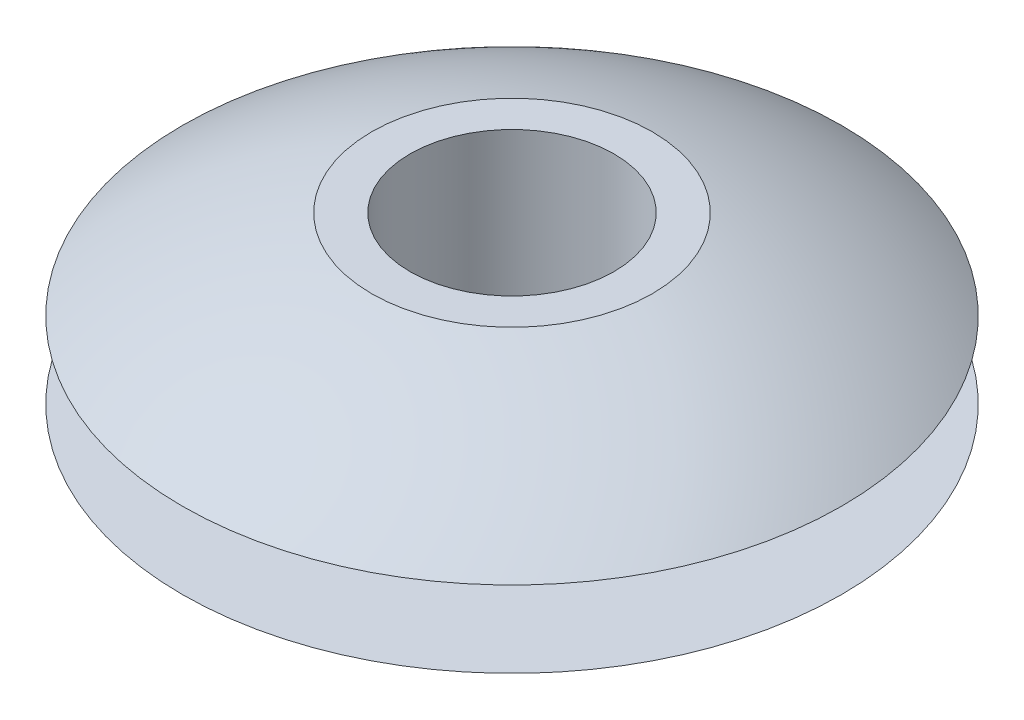
ISO-10303-21;
HEADER;
FILE_DESCRIPTION(('STEP AP214'),'2;1');
FILE_NAME('part.step','',(''),(''),'','','');
FILE_SCHEMA(('AUTOMOTIVE_DESIGN { 1 0 10303 214 1 1 1 1 }'));
ENDSEC;
DATA;
#1=APPLICATION_CONTEXT('core data for automotive mechanical design processes');
#2=APPLICATION_PROTOCOL_DEFINITION('international standard','automotive_design',2000,#1);
#3=PRODUCT_CONTEXT('',#1,'mechanical');
#4=PRODUCT('Part','Part','',(#3));
#5=PRODUCT_RELATED_PRODUCT_CATEGORY('part','',(#4));
#6=PRODUCT_DEFINITION_FORMATION('','',#4);
#7=PRODUCT_DEFINITION_CONTEXT('part definition',#1,'design');
#8=PRODUCT_DEFINITION('design','',#6,#7);
#9=PRODUCT_DEFINITION_SHAPE('','',#8);
#10=(LENGTH_UNIT() NAMED_UNIT(*) SI_UNIT(.MILLI.,.METRE.));
#11=(NAMED_UNIT(*) PLANE_ANGLE_UNIT() SI_UNIT($,.RADIAN.));
#12=(NAMED_UNIT(*) SI_UNIT($,.STERADIAN.) SOLID_ANGLE_UNIT());
#13=UNCERTAINTY_MEASURE_WITH_UNIT(LENGTH_MEASURE(1.E-05),#10,'distance_accuracy_value','');
#14=(GEOMETRIC_REPRESENTATION_CONTEXT(3) GLOBAL_UNCERTAINTY_ASSIGNED_CONTEXT((#13)) GLOBAL_UNIT_ASSIGNED_CONTEXT((#10,
#11,#12)) REPRESENTATION_CONTEXT('',''));
#15=CARTESIAN_POINT('',(0.,0.,0.));
#16=DIRECTION('',(0.,0.,1.));
#17=DIRECTION('',(1.,0.,0.));
#18=AXIS2_PLACEMENT_3D('',#15,#16,#17);
#19=CARTESIAN_POINT('',(0.,-8.1507042020704,0.));
#20=DIRECTION('',(0.,1.,0.));
#21=DIRECTION('',(0.,0.,-1.));
#22=AXIS2_PLACEMENT_3D('',#19,#20,#21);
#23=SPHERICAL_SURFACE('',#22,11.);
#24=CARTESIAN_POINT('',(0.,2.5,0.));
#25=DIRECTION('',(0.,1.,0.));
#26=DIRECTION('',(0.,0.,1.));
#27=AXIS2_PLACEMENT_3D('',#24,#25,#26);
#28=CIRCLE('',#27,2.75);
#29=CARTESIAN_POINT('',(0.,2.5,-2.75000000000002));
#30=VERTEX_POINT('',#29);
#31=EDGE_CURVE('E59',#30,#30,#28,.T.);
#32=CARTESIAN_POINT('',(0.,0.750000000000001,0.));
#33=DIRECTION('',(0.,1.,0.));
#34=DIRECTION('',(0.,0.,1.));
#35=AXIS2_PLACEMENT_3D('',#32,#33,#34);
#36=CIRCLE('',#35,6.46354892510658);
#37=CARTESIAN_POINT('',(0.,0.749999999999999,-6.46354892510658));
#38=VERTEX_POINT('',#37);
#39=EDGE_CURVE('E10',#38,#38,#36,.T.);
#40=CARTESIAN_POINT('',(0.,2.5,-2.75000000000002));
#41=CARTESIAN_POINT('',(0.,2.489246263885,-2.79164909075996));
#42=CARTESIAN_POINT('',(0.,2.47824820386657,-2.83323509709761));
#43=CARTESIAN_POINT('',(0.,2.4557650024796,-2.91627523204028));
#44=CARTESIAN_POINT('',(0.,2.44427986111107,-2.95772936064529));
#45=CARTESIAN_POINT('',(0.,2.4208240634807,-3.04050003123465));
#46=CARTESIAN_POINT('',(0.,2.40885340721886,-3.08181657321899));
#47=CARTESIAN_POINT('',(0.,2.38442823103843,-3.1643063854772));
#48=CARTESIAN_POINT('',(0.,2.37197371111983,-3.20547965575107));
#49=CARTESIAN_POINT('',(0.,2.34658252064056,-3.28767725791299));
#50=CARTESIAN_POINT('',(0.,2.33364585007988,-3.32870158980105));
#51=CARTESIAN_POINT('',(0.,2.30729213897582,-3.41059566936254));
#52=CARTESIAN_POINT('',(0.,2.29387509843244,-3.45146541703598));
#53=CARTESIAN_POINT('',(0.,2.2665624937869,-3.53304470352028));
#54=CARTESIAN_POINT('',(0.,2.25266692968475,-3.57375424233113));
#55=CARTESIAN_POINT('',(0.,2.22439919029418,-3.65500750851582));
#56=CARTESIAN_POINT('',(0.,2.21002701500575,-3.69555123588965));
#57=CARTESIAN_POINT('',(0.,2.18080803118311,-3.77646729943865));
#58=CARTESIAN_POINT('',(0.,2.16596122264889,-3.81683963561382));
#59=CARTESIAN_POINT('',(0.,2.13579501560235,-3.89740736059306));
#60=CARTESIAN_POINT('',(0.,2.12047561709004,-3.93760274939714));
#61=CARTESIAN_POINT('',(0.,2.08936633839261,-4.01781104781338));
#62=CARTESIAN_POINT('',(0.,2.0735764582075,-4.05782395742554));
#63=CARTESIAN_POINT('',(0.,2.04152838921947,-4.13766179075061));
#64=CARTESIAN_POINT('',(0.,2.02527020041656,-4.17748671446352));
#65=CARTESIAN_POINT('',(0.,1.99228775169797,-4.25694309515399));
#66=CARTESIAN_POINT('',(0.,1.97556349178229,-4.29657455213154));
#67=CARTESIAN_POINT('',(0.,1.94165120248547,-4.3756385451407));
#68=CARTESIAN_POINT('',(0.,1.92446317310432,-4.4150710811723));
#69=CARTESIAN_POINT('',(0.,1.88962571034932,-4.49373180545511));
#70=CARTESIAN_POINT('',(0.,1.87197627697547,-4.53295999370632));
#71=CARTESIAN_POINT('',(0.,1.83621843520772,-4.61120662371693));
#72=CARTESIAN_POINT('',(0.,1.81811002681384,-4.65022506547632));
#73=CARTESIAN_POINT('',(0.,1.78143672714437,-4.72804683265785));
#74=CARTESIAN_POINT('',(0.,1.76287183586878,-4.76685015807998));
#75=CARTESIAN_POINT('',(0.,1.7252881253969,-4.84423635234659));
#76=CARTESIAN_POINT('',(0.,1.7062693062006,-4.88281922119105));
#77=CARTESIAN_POINT('',(0.,1.66778035731933,-4.95975919240185));
#78=CARTESIAN_POINT('',(0.,1.64831022763435,-4.99811629476818));
#79=CARTESIAN_POINT('',(0.,1.60892133731859,-5.07459945419295));
#80=CARTESIAN_POINT('',(0.,1.58900257668779,-5.1127255112514));
#81=CARTESIAN_POINT('',(0.,1.5487191657653,-5.18874133302787));
#82=CARTESIAN_POINT('',(0.,1.5283545154736,-5.2266310977459));
#83=CARTESIAN_POINT('',(0.,1.48718212787902,-5.30216912032833));
#84=CARTESIAN_POINT('',(0.,1.46637439057614,-5.33981737819275));
#85=CARTESIAN_POINT('',(0.,1.42431869258791,-5.41486720579165));
#86=CARTESIAN_POINT('',(0.,1.40307073190255,-5.45226877552613));
#87=CARTESIAN_POINT('',(0.,1.36013751136346,-5.52682007953919));
#88=CARTESIAN_POINT('',(0.,1.33845225150972,-5.56396981381776));
#89=CARTESIAN_POINT('',(0.,1.29464741702896,-5.63801233425033));
#90=CARTESIAN_POINT('',(0.,1.27252784240196,-5.67490512040433));
#91=CARTESIAN_POINT('',(0.,1.22785742254723,-5.74842866728515));
#92=CARTESIAN_POINT('',(0.,1.20530657731952,-5.78505942801196));
#93=CARTESIAN_POINT('',(0.,1.15977671976784,-5.85805388278172));
#94=CARTESIAN_POINT('',(0.,1.13679770744387,-5.89441757682465));
#95=CARTESIAN_POINT('',(0.,1.09041467820817,-5.96687289378001));
#96=CARTESIAN_POINT('',(0.,1.06701066129643,-6.00296451669243));
#97=CARTESIAN_POINT('',(0.,1.01978084359208,-6.07487072417647));
#98=CARTESIAN_POINT('',(0.,0.995955042799467,-6.1106853087481));
#99=CARTESIAN_POINT('',(0.,0.9478849371777,-6.18203251123952));
#100=CARTESIAN_POINT('',(0.,0.923640632348549,-6.21756512915931));
#101=CARTESIAN_POINT('',(0.,0.874736852025339,-6.28834350595893));
#102=CARTESIAN_POINT('',(0.,0.850077376531281,-6.32358926483875));
#103=CARTESIAN_POINT('',(0.,0.800346660571288,-6.39378908140553));
#104=CARTESIAN_POINT('',(0.,0.775275420105355,-6.42874313909249));
#105=CARTESIAN_POINT('',(0.,0.749999999999999,-6.46354892510658));
#106=B_SPLINE_CURVE_WITH_KNOTS('',3,(#40,#41,#42,#43,#44,#45,#46,#47,#48,#49,#50,#51,#52,#53,
#54,#55,#56,#57,#58,#59,#60,#61,#62,#63,#64,#65,#66,#67,#68,#69,#70,#71,#72,#73,#74,#75,#76,#77,
#78,#79,#80,#81,#82,#83,#84,#85,#86,#87,#88,#89,#90,#91,#92,#93,#94,#95,#96,#97,#98,#99,#100,
#101,#102,#103,#104,#105),.UNSPECIFIED.,.F.,.F.,(4,2,2,2,2,2,2,2,2,2,2,2,2,2,2,2,2,2,2,2,2,2,2,
2,2,2,2,2,2,2,2,2,4),(0.,0.129044237844231,0.258088475688461,0.387132713532692,
0.516176951376923,0.645221189221153,0.774265427065384,0.903309664909614,1.03235390275384,
1.16139814059808,1.29044237844231,1.41948661628654,1.54853085413077,1.677575091975,
1.80661932981923,1.93566356766346,2.06470780550769,2.19375204335192,2.32279628119615,
2.45184051904038,2.58088475688461,2.70992899472884,2.83897323257307,2.9680174704173,
3.09706170826153,3.22610594610576,3.35515018394999,3.48419442179422,3.61323865963845,
3.74228289748268,3.87132713532691,4.00037137317115,4.12941561101538),.UNSPECIFIED.);
#107=EDGE_CURVE('BSEAM31',#30,#38,#106,.T.);
#108=ORIENTED_EDGE('',*,*,#31,.F.);
#109=ORIENTED_EDGE('',*,*,#39,.T.);
#110=ORIENTED_EDGE('',*,*,#107,.T.);
#111=ORIENTED_EDGE('',*,*,#107,.F.);
#112=EDGE_LOOP('',(#108,#110,#109,#111));
#113=FACE_BOUND('',#112,.T.);
#114=ADVANCED_FACE('F31',(#113),#23,.T.);
#115=CARTESIAN_POINT('',(0.,0.75,-6.46354892510658));
#116=DIRECTION('',(0.,1.,0.));
#117=DIRECTION('',(0.,0.,1.));
#118=AXIS2_PLACEMENT_3D('',#115,#116,#117);
#119=PLANE('',#118);
#120=ORIENTED_EDGE('',*,*,#39,.F.);
#121=EDGE_LOOP('',(#120));
#122=FACE_BOUND('',#121,.T.);
#123=CARTESIAN_POINT('',(0.,0.750000000000001,0.));
#124=DIRECTION('',(0.,1.,0.));
#125=DIRECTION('',(0.,0.,1.));
#126=AXIS2_PLACEMENT_3D('',#123,#124,#125);
#127=CIRCLE('',#126,2.75);
#128=CARTESIAN_POINT('',(0.,0.750000000000001,2.75));
#129=VERTEX_POINT('',#128);
#130=EDGE_CURVE('E37',#129,#129,#127,.T.);
#131=ORIENTED_EDGE('',*,*,#130,.T.);
#132=EDGE_LOOP('',(#131));
#133=FACE_BOUND('',#132,.T.);
#134=ADVANCED_FACE('F66',(#122,#133),#119,.F.);
#135=CARTESIAN_POINT('',(0.,32.3385527519094,0.));
#136=DIRECTION('',(0.,1.,0.));
#137=DIRECTION('',(0.,0.,1.));
#138=AXIS2_PLACEMENT_3D('',#135,#136,#137);
#139=CYLINDRICAL_SURFACE('',#138,2.75);
#140=ORIENTED_EDGE('',*,*,#130,.F.);
#141=EDGE_LOOP('',(#140));
#142=FACE_BOUND('',#141,.T.);
#143=CARTESIAN_POINT('',(0.,-0.750000000000001,0.));
#144=DIRECTION('',(0.,1.,0.));
#145=DIRECTION('',(0.,0.,1.));
#146=AXIS2_PLACEMENT_3D('',#143,#144,#145);
#147=CIRCLE('',#146,2.75);
#148=CARTESIAN_POINT('',(0.,-0.750000000000001,2.75));
#149=VERTEX_POINT('',#148);
#150=EDGE_CURVE('E41',#149,#149,#147,.T.);
#151=ORIENTED_EDGE('',*,*,#150,.T.);
#152=EDGE_LOOP('',(#151));
#153=FACE_BOUND('',#152,.T.);
#154=ADVANCED_FACE('F70',(#142,#153),#139,.T.);
#155=CARTESIAN_POINT('',(0.,-0.749999999999999,-6.46354892510658));
#156=DIRECTION('',(0.,-1.,0.));
#157=DIRECTION('',(0.,0.,-1.));
#158=AXIS2_PLACEMENT_3D('',#155,#156,#157);
#159=PLANE('',#158);
#160=ORIENTED_EDGE('',*,*,#150,.F.);
#161=EDGE_LOOP('',(#160));
#162=FACE_BOUND('',#161,.T.);
#163=CARTESIAN_POINT('',(0.,-0.750000000000001,0.));
#164=DIRECTION('',(0.,1.,0.));
#165=DIRECTION('',(0.,0.,1.));
#166=AXIS2_PLACEMENT_3D('',#163,#164,#165);
#167=CIRCLE('',#166,6.46354892510658);
#168=CARTESIAN_POINT('',(0.,-0.750000000000002,-6.46354892510658));
#169=VERTEX_POINT('',#168);
#170=EDGE_CURVE('E45',#169,#169,#167,.T.);
#171=ORIENTED_EDGE('',*,*,#170,.T.);
#172=EDGE_LOOP('',(#171));
#173=FACE_BOUND('',#172,.T.);
#174=ADVANCED_FACE('F75',(#162,#173),#159,.F.);
#175=CARTESIAN_POINT('',(0.,8.1507042020704,0.));
#176=DIRECTION('',(0.,1.,0.));
#177=DIRECTION('',(0.,0.,-1.));
#178=AXIS2_PLACEMENT_3D('',#175,#176,#177);
#179=SPHERICAL_SURFACE('',#178,11.);
#180=CARTESIAN_POINT('',(0.,-2.5,0.));
#181=DIRECTION('',(0.,1.,0.));
#182=DIRECTION('',(0.,0.,1.));
#183=AXIS2_PLACEMENT_3D('',#180,#181,#182);
#184=CIRCLE('',#183,2.75);
#185=CARTESIAN_POINT('',(0.,-2.5,-2.75));
#186=VERTEX_POINT('',#185);
#187=EDGE_CURVE('E50',#186,#186,#184,.T.);
#188=CARTESIAN_POINT('',(0.,-0.750000000000002,-6.46354892510658));
#189=CARTESIAN_POINT('',(0.,-0.775275420105356,-6.42874313909249));
#190=CARTESIAN_POINT('',(0.,-0.80034666057129,-6.39378908140552));
#191=CARTESIAN_POINT('',(0.,-0.850077376531282,-6.32358926483874));
#192=CARTESIAN_POINT('',(0.,-0.874736852025341,-6.28834350595893));
#193=CARTESIAN_POINT('',(0.,-0.923640632348551,-6.21756512915931));
#194=CARTESIAN_POINT('',(0.,-0.947884937177702,-6.18203251123952));
#195=CARTESIAN_POINT('',(0.,-0.99595504279947,-6.1106853087481));
#196=CARTESIAN_POINT('',(0.,-1.01978084359209,-6.07487072417647));
#197=CARTESIAN_POINT('',(0.,-1.06701066129644,-6.00296451669242));
#198=CARTESIAN_POINT('',(0.,-1.09041467820817,-5.96687289378001));
#199=CARTESIAN_POINT('',(0.,-1.13679770744387,-5.89441757682465));
#200=CARTESIAN_POINT('',(0.,-1.15977671976784,-5.85805388278171));
#201=CARTESIAN_POINT('',(0.,-1.20530657731952,-5.78505942801196));
#202=CARTESIAN_POINT('',(0.,-1.22785742254723,-5.74842866728515));
#203=CARTESIAN_POINT('',(0.,-1.27252784240196,-5.67490512040433));
#204=CARTESIAN_POINT('',(0.,-1.29464741702897,-5.63801233425032));
#205=CARTESIAN_POINT('',(0.,-1.33845225150972,-5.56396981381775));
#206=CARTESIAN_POINT('',(0.,-1.36013751136346,-5.52682007953918));
#207=CARTESIAN_POINT('',(0.,-1.40307073190256,-5.45226877552613));
#208=CARTESIAN_POINT('',(0.,-1.42431869258791,-5.41486720579164));
#209=CARTESIAN_POINT('',(0.,-1.46637439057615,-5.33981737819274));
#210=CARTESIAN_POINT('',(0.,-1.48718212787902,-5.30216912032833));
#211=CARTESIAN_POINT('',(0.,-1.5283545154736,-5.22663109774589));
#212=CARTESIAN_POINT('',(0.,-1.5487191657653,-5.18874133302786));
#213=CARTESIAN_POINT('',(0.,-1.5890025766878,-5.11272551125139));
#214=CARTESIAN_POINT('',(0.,-1.60892133731859,-5.07459945419294));
#215=CARTESIAN_POINT('',(0.,-1.64831022763436,-4.99811629476817));
#216=CARTESIAN_POINT('',(0.,-1.66778035731933,-4.95975919240184));
#217=CARTESIAN_POINT('',(0.,-1.70626930620061,-4.88281922119104));
#218=CARTESIAN_POINT('',(0.,-1.7252881253969,-4.84423635234658));
#219=CARTESIAN_POINT('',(0.,-1.76287183586879,-4.76685015807997));
#220=CARTESIAN_POINT('',(0.,-1.78143672714437,-4.72804683265784));
#221=CARTESIAN_POINT('',(0.,-1.81811002681384,-4.65022506547631));
#222=CARTESIAN_POINT('',(0.,-1.83621843520773,-4.61120662371692));
#223=CARTESIAN_POINT('',(0.,-1.87197627697547,-4.53295999370631));
#224=CARTESIAN_POINT('',(0.,-1.88962571034933,-4.4937318054551));
#225=CARTESIAN_POINT('',(0.,-1.92446317310433,-4.41507108117229));
#226=CARTESIAN_POINT('',(0.,-1.94165120248548,-4.37563854514069));
#227=CARTESIAN_POINT('',(0.,-1.9755634917823,-4.29657455213153));
#228=CARTESIAN_POINT('',(0.,-1.99228775169798,-4.25694309515398));
#229=CARTESIAN_POINT('',(0.,-2.02527020041657,-4.17748671446351));
#230=CARTESIAN_POINT('',(0.,-2.04152838921948,-4.13766179075059));
#231=CARTESIAN_POINT('',(0.,-2.0735764582075,-4.05782395742552));
#232=CARTESIAN_POINT('',(0.,-2.08936633839261,-4.01781104781336));
#233=CARTESIAN_POINT('',(0.,-2.12047561709004,-3.93760274939713));
#234=CARTESIAN_POINT('',(0.,-2.13579501560236,-3.89740736059305));
#235=CARTESIAN_POINT('',(0.,-2.16596122264889,-3.8168396356138));
#236=CARTESIAN_POINT('',(0.,-2.18080803118311,-3.77646729943864));
#237=CARTESIAN_POINT('',(0.,-2.21002701500576,-3.69555123588964));
#238=CARTESIAN_POINT('',(0.,-2.22439919029418,-3.6550075085158));
#239=CARTESIAN_POINT('',(0.,-2.25266692968476,-3.57375424233112));
#240=CARTESIAN_POINT('',(0.,-2.26656249378691,-3.53304470352026));
#241=CARTESIAN_POINT('',(0.,-2.29387509843244,-3.45146541703597));
#242=CARTESIAN_POINT('',(0.,-2.30729213897582,-3.41059566936253));
#243=CARTESIAN_POINT('',(0.,-2.33364585007989,-3.32870158980103));
#244=CARTESIAN_POINT('',(0.,-2.34658252064057,-3.28767725791298));
#245=CARTESIAN_POINT('',(0.,-2.37197371111984,-3.20547965575105));
#246=CARTESIAN_POINT('',(0.,-2.38442823103843,-3.16430638547718));
#247=CARTESIAN_POINT('',(0.,-2.40885340721886,-3.08181657321897));
#248=CARTESIAN_POINT('',(0.,-2.42082406348071,-3.04050003123463));
#249=CARTESIAN_POINT('',(0.,-2.44427986111108,-2.95772936064528));
#250=CARTESIAN_POINT('',(0.,-2.45576500247961,-2.91627523204026));
#251=CARTESIAN_POINT('',(0.,-2.47824820386657,-2.83323509709759));
#252=CARTESIAN_POINT('',(0.,-2.48924626388501,-2.79164909075994));
#253=CARTESIAN_POINT('',(0.,-2.5,-2.75));
#254=B_SPLINE_CURVE_WITH_KNOTS('',3,(#188,#189,#190,#191,#192,#193,#194,#195,#196,#197,#198,
#199,#200,#201,#202,#203,#204,#205,#206,#207,#208,#209,#210,#211,#212,#213,#214,#215,#216,#217,
#218,#219,#220,#221,#222,#223,#224,#225,#226,#227,#228,#229,#230,#231,#232,#233,#234,#235,#236,
#237,#238,#239,#240,#241,#242,#243,#244,#245,#246,#247,#248,#249,#250,#251,#252,#253),
.UNSPECIFIED.,.F.,.F.,(4,2,2,2,2,2,2,2,2,2,2,2,2,2,2,2,2,2,2,2,2,2,2,2,2,2,2,2,2,2,2,2,4),(0.,
0.129044237844231,0.258088475688461,0.387132713532693,0.516176951376925,0.645221189221154,
0.774265427065386,0.903309664909615,1.03235390275385,1.16139814059808,1.29044237844231,
1.41948661628654,1.54853085413077,1.677575091975,1.80661932981923,1.93566356766347,
2.0647078055077,2.19375204335193,2.32279628119616,2.45184051904039,2.58088475688462,
2.70992899472885,2.83897323257308,2.96801747041731,3.09706170826154,3.22610594610578,
3.35515018395001,3.48419442179424,3.61323865963847,3.7422828974827,3.87132713532693,
4.00037137317116,4.12941561101539),.UNSPECIFIED.);
#255=EDGE_CURVE('BSEAM81',#169,#186,#254,.T.);
#256=ORIENTED_EDGE('',*,*,#170,.F.);
#257=ORIENTED_EDGE('',*,*,#187,.T.);
#258=ORIENTED_EDGE('',*,*,#255,.T.);
#259=ORIENTED_EDGE('',*,*,#255,.F.);
#260=EDGE_LOOP('',(#256,#258,#257,#259));
#261=FACE_BOUND('',#260,.T.);
#262=ADVANCED_FACE('F81',(#261),#179,.T.);
#263=CARTESIAN_POINT('',(0.,-2.5,-2.75));
#264=DIRECTION('',(0.,1.,0.));
#265=DIRECTION('',(0.,0.,1.));
#266=AXIS2_PLACEMENT_3D('',#263,#264,#265);
#267=PLANE('',#266);
#268=ORIENTED_EDGE('',*,*,#187,.F.);
#269=EDGE_LOOP('',(#268));
#270=FACE_BOUND('',#269,.T.);
#271=CARTESIAN_POINT('',(0.,-2.5,0.));
#272=DIRECTION('',(0.,1.,0.));
#273=DIRECTION('',(0.,0.,1.));
#274=AXIS2_PLACEMENT_3D('',#271,#272,#273);
#275=CIRCLE('',#274,2.);
#276=CARTESIAN_POINT('',(0.,-2.5,2.));
#277=VERTEX_POINT('',#276);
#278=EDGE_CURVE('E53',#277,#277,#275,.T.);
#279=ORIENTED_EDGE('',*,*,#278,.T.);
#280=EDGE_LOOP('',(#279));
#281=FACE_BOUND('',#280,.T.);
#282=ADVANCED_FACE('F85',(#270,#281),#267,.F.);
#283=CARTESIAN_POINT('',(0.,32.3385527519094,0.));
#284=DIRECTION('',(0.,1.,0.));
#285=DIRECTION('',(0.,0.,1.));
#286=AXIS2_PLACEMENT_3D('',#283,#284,#285);
#287=CYLINDRICAL_SURFACE('',#286,2.);
#288=ORIENTED_EDGE('',*,*,#278,.F.);
#289=EDGE_LOOP('',(#288));
#290=FACE_BOUND('',#289,.T.);
#291=CARTESIAN_POINT('',(0.,2.5,0.));
#292=DIRECTION('',(0.,1.,0.));
#293=DIRECTION('',(0.,0.,1.));
#294=AXIS2_PLACEMENT_3D('',#291,#292,#293);
#295=CIRCLE('',#294,2.);
#296=CARTESIAN_POINT('',(0.,2.5,2.));
#297=VERTEX_POINT('',#296);
#298=EDGE_CURVE('E56',#297,#297,#295,.T.);
#299=ORIENTED_EDGE('',*,*,#298,.T.);
#300=EDGE_LOOP('',(#299));
#301=FACE_BOUND('',#300,.T.);
#302=ADVANCED_FACE('F89',(#290,#301),#287,.F.);
#303=CARTESIAN_POINT('',(0.,2.5,-2.75));
#304=DIRECTION('',(0.,-1.,0.));
#305=DIRECTION('',(0.,0.,-1.));
#306=AXIS2_PLACEMENT_3D('',#303,#304,#305);
#307=PLANE('',#306);
#308=ORIENTED_EDGE('',*,*,#298,.F.);
#309=EDGE_LOOP('',(#308));
#310=FACE_BOUND('',#309,.T.);
#311=ORIENTED_EDGE('',*,*,#31,.T.);
#312=EDGE_LOOP('',(#311));
#313=FACE_BOUND('',#312,.T.);
#314=ADVANCED_FACE('F63',(#310,#313),#307,.F.);
#315=CLOSED_SHELL('',(#114,#134,#154,#174,#262,#282,#302,#314));
#316=MANIFOLD_SOLID_BREP('B2',#315);
#317=ADVANCED_BREP_SHAPE_REPRESENTATION('',(#18,#316),#14);
#318=SHAPE_DEFINITION_REPRESENTATION(#9,#317);
ENDSEC;
END-ISO-10303-21;
